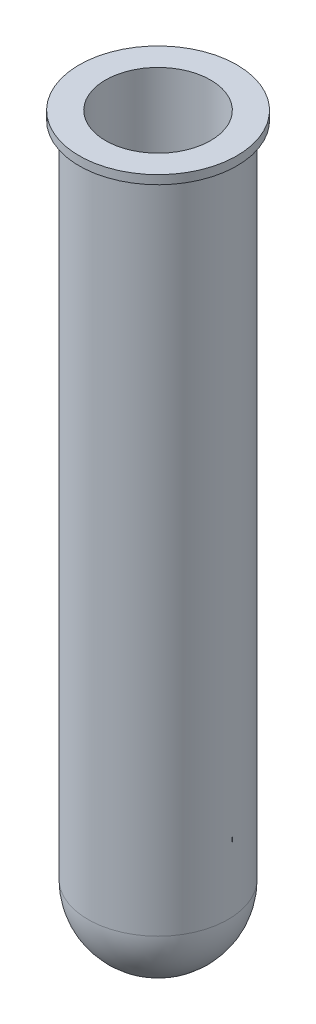
ISO-10303-21;
HEADER;
FILE_DESCRIPTION(('STEP AP214'),'2;1');
FILE_NAME('part.step','',(''),(''),'','','');
FILE_SCHEMA(('AUTOMOTIVE_DESIGN { 1 0 10303 214 1 1 1 1 }'));
ENDSEC;
DATA;
#1=APPLICATION_CONTEXT('core data for automotive mechanical design processes');
#2=APPLICATION_PROTOCOL_DEFINITION('international standard','automotive_design',2000,#1);
#3=PRODUCT_CONTEXT('',#1,'mechanical');
#4=PRODUCT('Part','Part','',(#3));
#5=PRODUCT_RELATED_PRODUCT_CATEGORY('part','',(#4));
#6=PRODUCT_DEFINITION_FORMATION('','',#4);
#7=PRODUCT_DEFINITION_CONTEXT('part definition',#1,'design');
#8=PRODUCT_DEFINITION('design','',#6,#7);
#9=PRODUCT_DEFINITION_SHAPE('','',#8);
#10=(LENGTH_UNIT() NAMED_UNIT(*) SI_UNIT(.MILLI.,.METRE.));
#11=(NAMED_UNIT(*) PLANE_ANGLE_UNIT() SI_UNIT($,.RADIAN.));
#12=(NAMED_UNIT(*) SI_UNIT($,.STERADIAN.) SOLID_ANGLE_UNIT());
#13=UNCERTAINTY_MEASURE_WITH_UNIT(LENGTH_MEASURE(1.E-05),#10,'distance_accuracy_value','');
#14=(GEOMETRIC_REPRESENTATION_CONTEXT(3) GLOBAL_UNCERTAINTY_ASSIGNED_CONTEXT((#13)) GLOBAL_UNIT_ASSIGNED_CONTEXT((#10,
#11,#12)) REPRESENTATION_CONTEXT('',''));
#15=CARTESIAN_POINT('',(0.,0.,0.));
#16=DIRECTION('',(0.,0.,1.));
#17=DIRECTION('',(1.,0.,0.));
#18=AXIS2_PLACEMENT_3D('',#15,#16,#17);
#19=CARTESIAN_POINT('',(0.,6.,0.));
#20=DIRECTION('',(0.,-1.,0.));
#21=DIRECTION('',(1.,0.,0.));
#22=AXIS2_PLACEMENT_3D('',#19,#20,#21);
#23=SPHERICAL_SURFACE('',#22,6.);
#24=CARTESIAN_POINT('',(0.,6.,0.));
#25=DIRECTION('',(0.,-1.,0.));
#26=DIRECTION('',(0.,0.,-1.));
#27=AXIS2_PLACEMENT_3D('',#24,#25,#26);
#28=CIRCLE('',#27,6.);
#29=CARTESIAN_POINT('',(0.,6.,-6.));
#30=VERTEX_POINT('',#29);
#31=EDGE_CURVE('E10',#30,#30,#28,.T.);
#32=ORIENTED_EDGE('',*,*,#31,.F.);
#33=EDGE_LOOP('',(#32));
#34=FACE_BOUND('',#33,.T.);
#35=ADVANCED_FACE('F40',(#34),#23,.F.);
#36=CARTESIAN_POINT('',(0.,0.,0.));
#37=DIRECTION('',(0.,-1.,0.));
#38=DIRECTION('',(0.,0.,-1.));
#39=AXIS2_PLACEMENT_3D('',#36,#37,#38);
#40=CYLINDRICAL_SURFACE('',#39,6.);
#41=CARTESIAN_POINT('',(0.,82.,0.));
#42=DIRECTION('',(0.,-1.,0.));
#43=DIRECTION('',(0.,0.,-1.));
#44=AXIS2_PLACEMENT_3D('',#41,#42,#43);
#45=CIRCLE('',#44,6.);
#46=CARTESIAN_POINT('',(0.,82.,-6.));
#47=VERTEX_POINT('',#46);
#48=EDGE_CURVE('E46',#47,#47,#45,.T.);
#49=ORIENTED_EDGE('',*,*,#48,.F.);
#50=EDGE_LOOP('',(#49));
#51=FACE_BOUND('',#50,.T.);
#52=ORIENTED_EDGE('',*,*,#31,.T.);
#53=EDGE_LOOP('',(#52));
#54=FACE_BOUND('',#53,.T.);
#55=ADVANCED_FACE('F88',(#51,#54),#40,.F.);
#56=CARTESIAN_POINT('',(-6.,82.,0.));
#57=DIRECTION('',(0.,-1.,0.));
#58=DIRECTION('',(0.,0.,-1.));
#59=AXIS2_PLACEMENT_3D('',#56,#57,#58);
#60=PLANE('',#59);
#61=CARTESIAN_POINT('',(0.,82.,0.));
#62=DIRECTION('',(0.,-1.,0.));
#63=DIRECTION('',(0.,0.,-1.));
#64=AXIS2_PLACEMENT_3D('',#61,#62,#63);
#65=CIRCLE('',#64,9.);
#66=CARTESIAN_POINT('',(0.,82.,-9.));
#67=VERTEX_POINT('',#66);
#68=EDGE_CURVE('E50',#67,#67,#65,.T.);
#69=ORIENTED_EDGE('',*,*,#68,.F.);
#70=EDGE_LOOP('',(#69));
#71=FACE_BOUND('',#70,.T.);
#72=ORIENTED_EDGE('',*,*,#48,.T.);
#73=EDGE_LOOP('',(#72));
#74=FACE_BOUND('',#73,.T.);
#75=ADVANCED_FACE('F83',(#71,#74),#60,.F.);
#76=CARTESIAN_POINT('',(0.,0.,0.));
#77=DIRECTION('',(0.,-1.,0.));
#78=DIRECTION('',(0.,0.,-1.));
#79=AXIS2_PLACEMENT_3D('',#76,#77,#78);
#80=CYLINDRICAL_SURFACE('',#79,9.);
#81=CARTESIAN_POINT('',(0.,81.,0.));
#82=DIRECTION('',(0.,-1.,0.));
#83=DIRECTION('',(0.,0.,-1.));
#84=AXIS2_PLACEMENT_3D('',#81,#82,#83);
#85=CIRCLE('',#84,9.);
#86=CARTESIAN_POINT('',(0.,81.,-9.));
#87=VERTEX_POINT('',#86);
#88=EDGE_CURVE('E54',#87,#87,#85,.T.);
#89=ORIENTED_EDGE('',*,*,#88,.F.);
#90=EDGE_LOOP('',(#89));
#91=FACE_BOUND('',#90,.T.);
#92=ORIENTED_EDGE('',*,*,#68,.T.);
#93=EDGE_LOOP('',(#92));
#94=FACE_BOUND('',#93,.T.);
#95=ADVANCED_FACE('F77',(#91,#94),#80,.T.);
#96=CARTESIAN_POINT('',(-9.,81.,0.));
#97=DIRECTION('',(0.,1.,0.));
#98=DIRECTION('',(0.,0.,1.));
#99=AXIS2_PLACEMENT_3D('',#96,#97,#98);
#100=PLANE('',#99);
#101=CARTESIAN_POINT('',(0.,81.,0.));
#102=DIRECTION('',(0.,-1.,0.));
#103=DIRECTION('',(0.,0.,-1.));
#104=AXIS2_PLACEMENT_3D('',#101,#102,#103);
#105=CIRCLE('',#104,8.);
#106=CARTESIAN_POINT('',(0.,81.,-8.));
#107=VERTEX_POINT('',#106);
#108=EDGE_CURVE('E59',#107,#107,#105,.T.);
#109=ORIENTED_EDGE('',*,*,#108,.F.);
#110=EDGE_LOOP('',(#109));
#111=FACE_BOUND('',#110,.T.);
#112=ORIENTED_EDGE('',*,*,#88,.T.);
#113=EDGE_LOOP('',(#112));
#114=FACE_BOUND('',#113,.T.);
#115=ADVANCED_FACE('F71',(#111,#114),#100,.F.);
#116=CARTESIAN_POINT('',(0.,0.,0.));
#117=DIRECTION('',(0.,-1.,0.));
#118=DIRECTION('',(0.,0.,-1.));
#119=AXIS2_PLACEMENT_3D('',#116,#117,#118);
#120=CYLINDRICAL_SURFACE('',#119,8.);
#121=CARTESIAN_POINT('',(0.,6.,0.));
#122=DIRECTION('',(0.,-1.,0.));
#123=DIRECTION('',(0.,0.,-1.));
#124=AXIS2_PLACEMENT_3D('',#121,#122,#123);
#125=CIRCLE('',#124,8.);
#126=CARTESIAN_POINT('',(0.,6.,-8.));
#127=VERTEX_POINT('',#126);
#128=EDGE_CURVE('E62',#127,#127,#125,.T.);
#129=ORIENTED_EDGE('',*,*,#128,.F.);
#130=EDGE_LOOP('',(#129));
#131=FACE_BOUND('',#130,.T.);
#132=ORIENTED_EDGE('',*,*,#108,.T.);
#133=EDGE_LOOP('',(#132));
#134=FACE_BOUND('',#133,.T.);
#135=ADVANCED_FACE('F68',(#131,#134),#120,.T.);
#136=CARTESIAN_POINT('',(0.,6.,0.));
#137=DIRECTION('',(0.,-1.,0.));
#138=DIRECTION('',(-1.,0.,0.));
#139=AXIS2_PLACEMENT_3D('',#136,#137,#138);
#140=SPHERICAL_SURFACE('',#139,8.);
#141=ORIENTED_EDGE('',*,*,#128,.T.);
#142=EDGE_LOOP('',(#141));
#143=FACE_BOUND('',#142,.T.);
#144=ADVANCED_FACE('F66',(#143),#140,.T.);
#145=CLOSED_SHELL('',(#35,#55,#75,#95,#115,#135,#144));
#146=MANIFOLD_SOLID_BREP('B2',#145);
#147=ADVANCED_BREP_SHAPE_REPRESENTATION('',(#18,#146),#14);
#148=SHAPE_DEFINITION_REPRESENTATION(#9,#147);
ENDSEC;
END-ISO-10303-21;
